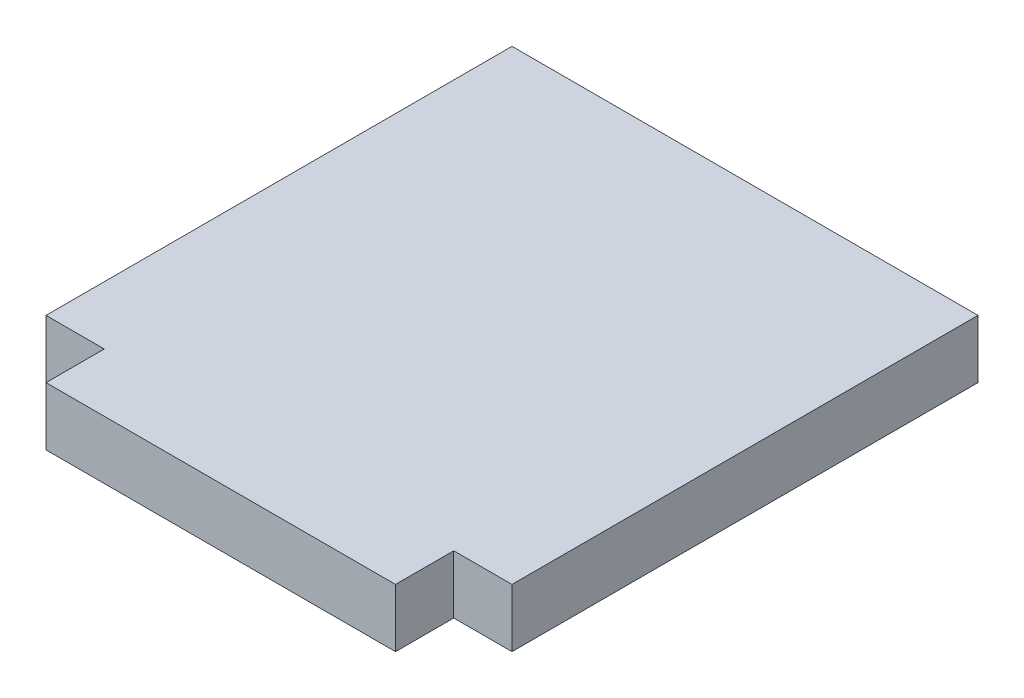
ISO-10303-21;
HEADER;
FILE_DESCRIPTION(('STEP AP214'),'2;1');
FILE_NAME('part.step','',(''),(''),'','','');
FILE_SCHEMA(('AUTOMOTIVE_DESIGN { 1 0 10303 214 1 1 1 1 }'));
ENDSEC;
DATA;
#1=APPLICATION_CONTEXT('core data for automotive mechanical design processes');
#2=APPLICATION_PROTOCOL_DEFINITION('international standard','automotive_design',2000,#1);
#3=PRODUCT_CONTEXT('',#1,'mechanical');
#4=PRODUCT('Part','Part','',(#3));
#5=PRODUCT_RELATED_PRODUCT_CATEGORY('part','',(#4));
#6=PRODUCT_DEFINITION_FORMATION('','',#4);
#7=PRODUCT_DEFINITION_CONTEXT('part definition',#1,'design');
#8=PRODUCT_DEFINITION('design','',#6,#7);
#9=PRODUCT_DEFINITION_SHAPE('','',#8);
#10=(LENGTH_UNIT() NAMED_UNIT(*) SI_UNIT(.MILLI.,.METRE.));
#11=(NAMED_UNIT(*) PLANE_ANGLE_UNIT() SI_UNIT($,.RADIAN.));
#12=(NAMED_UNIT(*) SI_UNIT($,.STERADIAN.) SOLID_ANGLE_UNIT());
#13=UNCERTAINTY_MEASURE_WITH_UNIT(LENGTH_MEASURE(1.E-05),#10,'distance_accuracy_value','');
#14=(GEOMETRIC_REPRESENTATION_CONTEXT(3) GLOBAL_UNCERTAINTY_ASSIGNED_CONTEXT((#13)) GLOBAL_UNIT_ASSIGNED_CONTEXT((#10,
#11,#12)) REPRESENTATION_CONTEXT('',''));
#15=CARTESIAN_POINT('',(0.,0.,0.));
#16=DIRECTION('',(0.,0.,1.));
#17=DIRECTION('',(1.,0.,0.));
#18=AXIS2_PLACEMENT_3D('',#15,#16,#17);
#19=CARTESIAN_POINT('',(0.,3.,-3.));
#20=DIRECTION('',(0.,0.,1.));
#21=DIRECTION('',(1.,0.,0.));
#22=AXIS2_PLACEMENT_3D('',#19,#20,#21);
#23=PLANE('',#22);
#24=DIRECTION('',(-1.,0.,0.));
#25=VECTOR('',#24,1.);
#26=CARTESIAN_POINT('',(0.,0.,-3.));
#27=LINE('',#26,#25);
#28=CARTESIAN_POINT('',(0.,0.,-3.));
#29=VERTEX_POINT('',#28);
#30=CARTESIAN_POINT('',(-3.,0.,-3.));
#31=VERTEX_POINT('',#30);
#32=EDGE_CURVE('E127',#29,#31,#27,.T.);
#33=ORIENTED_EDGE('',*,*,#32,.F.);
#34=DIRECTION('',(0.,-1.,0.));
#35=VECTOR('',#34,1.);
#36=CARTESIAN_POINT('',(0.,3.,-3.));
#37=LINE('',#36,#35);
#38=CARTESIAN_POINT('',(0.,3.,-3.));
#39=VERTEX_POINT('',#38);
#40=EDGE_CURVE('E11',#39,#29,#37,.T.);
#41=ORIENTED_EDGE('',*,*,#40,.F.);
#42=DIRECTION('',(-1.,0.,0.));
#43=VECTOR('',#42,1.);
#44=CARTESIAN_POINT('',(0.,3.,-3.));
#45=LINE('',#44,#43);
#46=CARTESIAN_POINT('',(-3.,3.,-3.));
#47=VERTEX_POINT('',#46);
#48=EDGE_CURVE('E146',#39,#47,#45,.T.);
#49=ORIENTED_EDGE('',*,*,#48,.T.);
#50=DIRECTION('',(0.,-1.,0.));
#51=VECTOR('',#50,1.);
#52=CARTESIAN_POINT('',(-3.,3.,-3.));
#53=LINE('',#52,#51);
#54=EDGE_CURVE('E51',#47,#31,#53,.T.);
#55=ORIENTED_EDGE('',*,*,#54,.T.);
#56=EDGE_LOOP('',(#33,#41,#49,#55));
#57=FACE_BOUND('',#56,.T.);
#58=ADVANCED_FACE('F35',(#57),#23,.T.);
#59=CARTESIAN_POINT('',(0.,3.,0.));
#60=DIRECTION('',(-1.,0.,0.));
#61=DIRECTION('',(0.,0.,1.));
#62=AXIS2_PLACEMENT_3D('',#59,#60,#61);
#63=PLANE('',#62);
#64=DIRECTION('',(0.,0.,-1.));
#65=VECTOR('',#64,1.);
#66=CARTESIAN_POINT('',(0.,0.,0.));
#67=LINE('',#66,#65);
#68=CARTESIAN_POINT('',(0.,0.,0.));
#69=VERTEX_POINT('',#68);
#70=EDGE_CURVE('E129',#69,#29,#67,.T.);
#71=ORIENTED_EDGE('',*,*,#70,.F.);
#72=DIRECTION('',(0.,-1.,0.));
#73=VECTOR('',#72,1.);
#74=CARTESIAN_POINT('',(0.,3.,0.));
#75=LINE('',#74,#73);
#76=CARTESIAN_POINT('',(0.,3.,0.));
#77=VERTEX_POINT('',#76);
#78=EDGE_CURVE('E43',#77,#69,#75,.T.);
#79=ORIENTED_EDGE('',*,*,#78,.F.);
#80=DIRECTION('',(0.,0.,-1.));
#81=VECTOR('',#80,1.);
#82=CARTESIAN_POINT('',(0.,3.,0.));
#83=LINE('',#82,#81);
#84=EDGE_CURVE('E168',#77,#39,#83,.T.);
#85=ORIENTED_EDGE('',*,*,#84,.T.);
#86=ORIENTED_EDGE('',*,*,#40,.T.);
#87=EDGE_LOOP('',(#71,#79,#85,#86));
#88=FACE_BOUND('',#87,.T.);
#89=ADVANCED_FACE('F167',(#88),#63,.T.);
#90=CARTESIAN_POINT('',(0.,3.,0.));
#91=DIRECTION('',(0.,0.,-1.));
#92=DIRECTION('',(-1.,0.,0.));
#93=AXIS2_PLACEMENT_3D('',#90,#91,#92);
#94=PLANE('',#93);
#95=DIRECTION('',(1.,0.,0.));
#96=VECTOR('',#95,1.);
#97=CARTESIAN_POINT('',(0.,0.,0.));
#98=LINE('',#97,#96);
#99=CARTESIAN_POINT('',(18.,0.,0.));
#100=VERTEX_POINT('',#99);
#101=EDGE_CURVE('E132',#69,#100,#98,.T.);
#102=ORIENTED_EDGE('',*,*,#101,.T.);
#103=DIRECTION('',(0.,-1.,0.));
#104=VECTOR('',#103,1.);
#105=CARTESIAN_POINT('',(18.,3.,0.));
#106=LINE('',#105,#104);
#107=CARTESIAN_POINT('',(18.,3.,0.));
#108=VERTEX_POINT('',#107);
#109=EDGE_CURVE('E152',#108,#100,#106,.T.);
#110=ORIENTED_EDGE('',*,*,#109,.F.);
#111=DIRECTION('',(1.,0.,0.));
#112=VECTOR('',#111,1.);
#113=CARTESIAN_POINT('',(0.,3.,0.));
#114=LINE('',#113,#112);
#115=EDGE_CURVE('E159',#77,#108,#114,.T.);
#116=ORIENTED_EDGE('',*,*,#115,.F.);
#117=ORIENTED_EDGE('',*,*,#78,.T.);
#118=EDGE_LOOP('',(#102,#110,#116,#117));
#119=FACE_BOUND('',#118,.T.);
#120=ADVANCED_FACE('F157',(#119),#94,.F.);
#121=CARTESIAN_POINT('',(18.,3.,0.));
#122=DIRECTION('',(-1.,0.,0.));
#123=DIRECTION('',(0.,0.,1.));
#124=AXIS2_PLACEMENT_3D('',#121,#122,#123);
#125=PLANE('',#124);
#126=DIRECTION('',(0.,0.,-1.));
#127=VECTOR('',#126,1.);
#128=CARTESIAN_POINT('',(18.,0.,0.));
#129=LINE('',#128,#127);
#130=CARTESIAN_POINT('',(18.,0.,-3.));
#131=VERTEX_POINT('',#130);
#132=EDGE_CURVE('E134',#100,#131,#129,.T.);
#133=ORIENTED_EDGE('',*,*,#132,.T.);
#134=DIRECTION('',(0.,-1.,0.));
#135=VECTOR('',#134,1.);
#136=CARTESIAN_POINT('',(18.,3.,-3.));
#137=LINE('',#136,#135);
#138=CARTESIAN_POINT('',(18.,3.,-3.));
#139=VERTEX_POINT('',#138);
#140=EDGE_CURVE('E150',#139,#131,#137,.T.);
#141=ORIENTED_EDGE('',*,*,#140,.F.);
#142=DIRECTION('',(0.,0.,-1.));
#143=VECTOR('',#142,1.);
#144=CARTESIAN_POINT('',(18.,3.,0.));
#145=LINE('',#144,#143);
#146=EDGE_CURVE('E261',#108,#139,#145,.T.);
#147=ORIENTED_EDGE('',*,*,#146,.F.);
#148=ORIENTED_EDGE('',*,*,#109,.T.);
#149=EDGE_LOOP('',(#133,#141,#147,#148));
#150=FACE_BOUND('',#149,.T.);
#151=ADVANCED_FACE('F186',(#150),#125,.F.);
#152=CARTESIAN_POINT('',(0.,3.,-3.));
#153=DIRECTION('',(0.,0.,1.));
#154=DIRECTION('',(1.,0.,0.));
#155=AXIS2_PLACEMENT_3D('',#152,#153,#154);
#156=PLANE('',#155);
#157=DIRECTION('',(-1.,0.,0.));
#158=VECTOR('',#157,1.);
#159=CARTESIAN_POINT('',(0.,0.,-3.));
#160=LINE('',#159,#158);
#161=CARTESIAN_POINT('',(21.,0.,-3.));
#162=VERTEX_POINT('',#161);
#163=EDGE_CURVE('E137',#162,#131,#160,.T.);
#164=ORIENTED_EDGE('',*,*,#163,.F.);
#165=DIRECTION('',(0.,-1.,0.));
#166=VECTOR('',#165,1.);
#167=CARTESIAN_POINT('',(21.,3.,-3.));
#168=LINE('',#167,#166);
#169=CARTESIAN_POINT('',(21.,3.,-3.));
#170=VERTEX_POINT('',#169);
#171=EDGE_CURVE('E119',#170,#162,#168,.T.);
#172=ORIENTED_EDGE('',*,*,#171,.F.);
#173=DIRECTION('',(-1.,0.,0.));
#174=VECTOR('',#173,1.);
#175=CARTESIAN_POINT('',(0.,3.,-3.));
#176=LINE('',#175,#174);
#177=EDGE_CURVE('E109',#170,#139,#176,.T.);
#178=ORIENTED_EDGE('',*,*,#177,.T.);
#179=ORIENTED_EDGE('',*,*,#140,.T.);
#180=EDGE_LOOP('',(#164,#172,#178,#179));
#181=FACE_BOUND('',#180,.T.);
#182=ADVANCED_FACE('F191',(#181),#156,.T.);
#183=CARTESIAN_POINT('',(21.,3.,0.));
#184=DIRECTION('',(-1.,0.,0.));
#185=DIRECTION('',(0.,0.,1.));
#186=AXIS2_PLACEMENT_3D('',#183,#184,#185);
#187=PLANE('',#186);
#188=DIRECTION('',(0.,0.,-1.));
#189=VECTOR('',#188,1.);
#190=CARTESIAN_POINT('',(21.,0.,0.));
#191=LINE('',#190,#189);
#192=CARTESIAN_POINT('',(21.,0.,-27.));
#193=VERTEX_POINT('',#192);
#194=EDGE_CURVE('E116',#162,#193,#191,.T.);
#195=ORIENTED_EDGE('',*,*,#194,.T.);
#196=DIRECTION('',(0.,-1.,0.));
#197=VECTOR('',#196,1.);
#198=CARTESIAN_POINT('',(21.,3.,-27.));
#199=LINE('',#198,#197);
#200=CARTESIAN_POINT('',(21.,3.,-27.));
#201=VERTEX_POINT('',#200);
#202=EDGE_CURVE('E113',#201,#193,#199,.T.);
#203=ORIENTED_EDGE('',*,*,#202,.F.);
#204=DIRECTION('',(0.,0.,-1.));
#205=VECTOR('',#204,1.);
#206=CARTESIAN_POINT('',(21.,3.,0.));
#207=LINE('',#206,#205);
#208=EDGE_CURVE('E102',#170,#201,#207,.T.);
#209=ORIENTED_EDGE('',*,*,#208,.F.);
#210=ORIENTED_EDGE('',*,*,#171,.T.);
#211=EDGE_LOOP('',(#195,#203,#209,#210));
#212=FACE_BOUND('',#211,.T.);
#213=ADVANCED_FACE('F114',(#212),#187,.F.);
#214=CARTESIAN_POINT('',(0.,3.,-27.));
#215=DIRECTION('',(0.,0.,1.));
#216=DIRECTION('',(1.,0.,0.));
#217=AXIS2_PLACEMENT_3D('',#214,#215,#216);
#218=PLANE('',#217);
#219=DIRECTION('',(-1.,0.,0.));
#220=VECTOR('',#219,1.);
#221=CARTESIAN_POINT('',(0.,0.,-27.));
#222=LINE('',#221,#220);
#223=CARTESIAN_POINT('',(-3.,0.,-27.));
#224=VERTEX_POINT('',#223);
#225=EDGE_CURVE('E141',#193,#224,#222,.T.);
#226=ORIENTED_EDGE('',*,*,#225,.T.);
#227=DIRECTION('',(0.,-1.,0.));
#228=VECTOR('',#227,1.);
#229=CARTESIAN_POINT('',(-3.,3.,-27.));
#230=LINE('',#229,#228);
#231=CARTESIAN_POINT('',(-3.,3.,-27.));
#232=VERTEX_POINT('',#231);
#233=EDGE_CURVE('E77',#232,#224,#230,.T.);
#234=ORIENTED_EDGE('',*,*,#233,.F.);
#235=DIRECTION('',(-1.,0.,0.));
#236=VECTOR('',#235,1.);
#237=CARTESIAN_POINT('',(0.,3.,-27.));
#238=LINE('',#237,#236);
#239=EDGE_CURVE('E107',#201,#232,#238,.T.);
#240=ORIENTED_EDGE('',*,*,#239,.F.);
#241=ORIENTED_EDGE('',*,*,#202,.T.);
#242=EDGE_LOOP('',(#226,#234,#240,#241));
#243=FACE_BOUND('',#242,.T.);
#244=ADVANCED_FACE('F121',(#243),#218,.F.);
#245=CARTESIAN_POINT('',(-3.,3.,0.));
#246=DIRECTION('',(-1.,0.,0.));
#247=DIRECTION('',(0.,0.,1.));
#248=AXIS2_PLACEMENT_3D('',#245,#246,#247);
#249=PLANE('',#248);
#250=DIRECTION('',(0.,0.,-1.));
#251=VECTOR('',#250,1.);
#252=CARTESIAN_POINT('',(-3.,0.,0.));
#253=LINE('',#252,#251);
#254=EDGE_CURVE('E143',#31,#224,#253,.T.);
#255=ORIENTED_EDGE('',*,*,#254,.F.);
#256=ORIENTED_EDGE('',*,*,#54,.F.);
#257=DIRECTION('',(0.,0.,-1.));
#258=VECTOR('',#257,1.);
#259=CARTESIAN_POINT('',(-3.,3.,0.));
#260=LINE('',#259,#258);
#261=EDGE_CURVE('E122',#47,#232,#260,.T.);
#262=ORIENTED_EDGE('',*,*,#261,.T.);
#263=ORIENTED_EDGE('',*,*,#233,.T.);
#264=EDGE_LOOP('',(#255,#256,#262,#263));
#265=FACE_BOUND('',#264,.T.);
#266=ADVANCED_FACE('F169',(#265),#249,.T.);
#267=CARTESIAN_POINT('',(0.,3.,0.));
#268=DIRECTION('',(0.,1.,0.));
#269=DIRECTION('',(0.,0.,1.));
#270=AXIS2_PLACEMENT_3D('',#267,#268,#269);
#271=PLANE('',#270);
#272=ORIENTED_EDGE('',*,*,#48,.F.);
#273=ORIENTED_EDGE('',*,*,#84,.F.);
#274=ORIENTED_EDGE('',*,*,#115,.T.);
#275=ORIENTED_EDGE('',*,*,#146,.T.);
#276=ORIENTED_EDGE('',*,*,#177,.F.);
#277=ORIENTED_EDGE('',*,*,#208,.T.);
#278=ORIENTED_EDGE('',*,*,#239,.T.);
#279=ORIENTED_EDGE('',*,*,#261,.F.);
#280=EDGE_LOOP('',(#272,#273,#274,#275,#276,#277,#278,#279));
#281=FACE_BOUND('',#280,.T.);
#282=ADVANCED_FACE('F104',(#281),#271,.T.);
#283=CARTESIAN_POINT('',(0.,0.,0.));
#284=DIRECTION('',(0.,1.,0.));
#285=DIRECTION('',(0.,0.,1.));
#286=AXIS2_PLACEMENT_3D('',#283,#284,#285);
#287=PLANE('',#286);
#288=ORIENTED_EDGE('',*,*,#32,.T.);
#289=ORIENTED_EDGE('',*,*,#254,.T.);
#290=ORIENTED_EDGE('',*,*,#225,.F.);
#291=ORIENTED_EDGE('',*,*,#194,.F.);
#292=ORIENTED_EDGE('',*,*,#163,.T.);
#293=ORIENTED_EDGE('',*,*,#132,.F.);
#294=ORIENTED_EDGE('',*,*,#101,.F.);
#295=ORIENTED_EDGE('',*,*,#70,.T.);
#296=EDGE_LOOP('',(#288,#289,#290,#291,#292,#293,#294,#295));
#297=FACE_BOUND('',#296,.T.);
#298=ADVANCED_FACE('F166',(#297),#287,.F.);
#299=CLOSED_SHELL('',(#58,#89,#120,#151,#182,#213,#244,#266,#282,#298));
#300=MANIFOLD_SOLID_BREP('B2',#299);
#301=ADVANCED_BREP_SHAPE_REPRESENTATION('',(#18,#300),#14);
#302=SHAPE_DEFINITION_REPRESENTATION(#9,#301);
ENDSEC;
END-ISO-10303-21;
